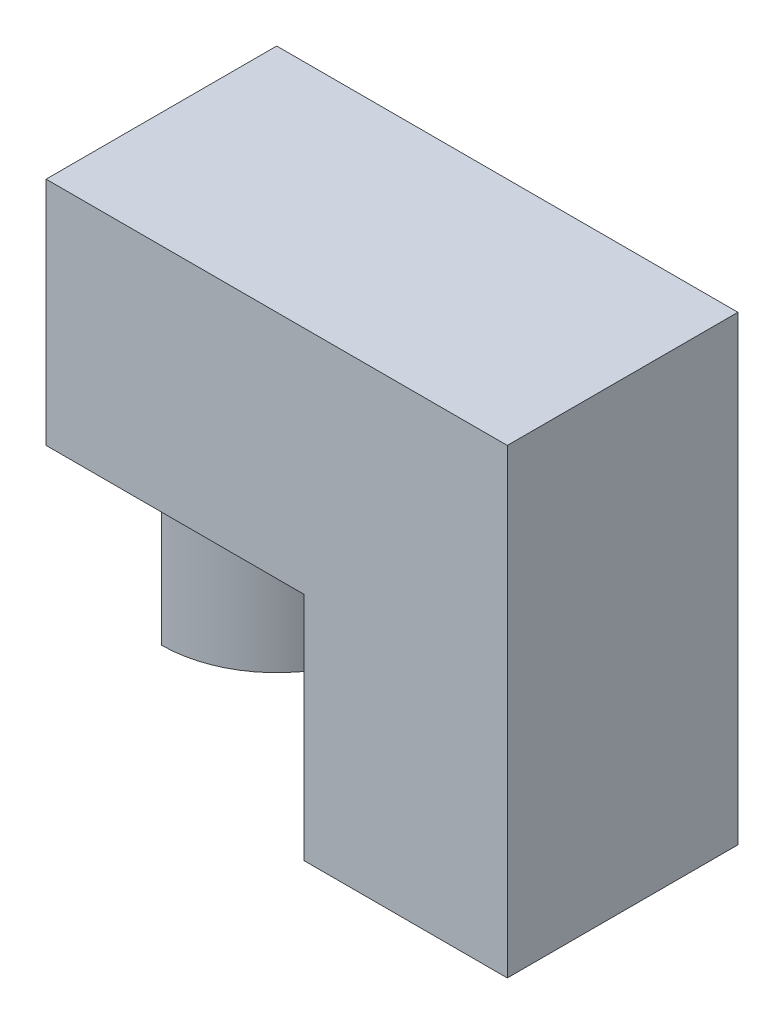
ISO-10303-21;
HEADER;
FILE_DESCRIPTION(('STEP AP214'),'2;1');
FILE_NAME('part.step','',(''),(''),'','','');
FILE_SCHEMA(('AUTOMOTIVE_DESIGN { 1 0 10303 214 1 1 1 1 }'));
ENDSEC;
DATA;
#1=APPLICATION_CONTEXT('core data for automotive mechanical design processes');
#2=APPLICATION_PROTOCOL_DEFINITION('international standard','automotive_design',2000,#1);
#3=PRODUCT_CONTEXT('',#1,'mechanical');
#4=PRODUCT('Part','Part','',(#3));
#5=PRODUCT_RELATED_PRODUCT_CATEGORY('part','',(#4));
#6=PRODUCT_DEFINITION_FORMATION('','',#4);
#7=PRODUCT_DEFINITION_CONTEXT('part definition',#1,'design');
#8=PRODUCT_DEFINITION('design','',#6,#7);
#9=PRODUCT_DEFINITION_SHAPE('','',#8);
#10=(LENGTH_UNIT() NAMED_UNIT(*) SI_UNIT(.MILLI.,.METRE.));
#11=(NAMED_UNIT(*) PLANE_ANGLE_UNIT() SI_UNIT($,.RADIAN.));
#12=(NAMED_UNIT(*) SI_UNIT($,.STERADIAN.) SOLID_ANGLE_UNIT());
#13=UNCERTAINTY_MEASURE_WITH_UNIT(LENGTH_MEASURE(1.E-05),#10,'distance_accuracy_value','');
#14=(GEOMETRIC_REPRESENTATION_CONTEXT(3) GLOBAL_UNCERTAINTY_ASSIGNED_CONTEXT((#13)) GLOBAL_UNIT_ASSIGNED_CONTEXT((#10,
#11,#12)) REPRESENTATION_CONTEXT('',''));
#15=CARTESIAN_POINT('',(0.,0.,0.));
#16=DIRECTION('',(0.,0.,1.));
#17=DIRECTION('',(1.,0.,0.));
#18=AXIS2_PLACEMENT_3D('',#15,#16,#17);
#19=CARTESIAN_POINT('',(0.,0.,10.));
#20=DIRECTION('',(0.,1.,0.));
#21=DIRECTION('',(0.,0.,1.));
#22=AXIS2_PLACEMENT_3D('',#19,#20,#21);
#23=PLANE('',#22);
#24=DIRECTION('',(1.,0.,0.));
#25=VECTOR('',#24,1.);
#26=CARTESIAN_POINT('',(0.,0.,0.));
#27=LINE('',#26,#25);
#28=CARTESIAN_POINT('',(0.,0.,0.));
#29=VERTEX_POINT('',#28);
#30=CARTESIAN_POINT('',(5.,0.,0.));
#31=VERTEX_POINT('',#30);
#32=EDGE_CURVE('E132',#29,#31,#27,.T.);
#33=ORIENTED_EDGE('',*,*,#32,.T.);
#34=CARTESIAN_POINT('',(0.,0.,0.));
#35=DIRECTION('',(0.,-1.,0.));
#36=DIRECTION('',(0.,0.,-1.));
#37=AXIS2_PLACEMENT_3D('',#34,#35,#36);
#38=CIRCLE('',#37,5.);
#39=CARTESIAN_POINT('',(0.,0.,5.));
#40=VERTEX_POINT('',#39);
#41=EDGE_CURVE('E130',#31,#40,#38,.T.);
#42=ORIENTED_EDGE('',*,*,#41,.T.);
#43=DIRECTION('',(0.,0.,-1.));
#44=VECTOR('',#43,1.);
#45=CARTESIAN_POINT('',(0.,0.,10.));
#46=LINE('',#45,#44);
#47=EDGE_CURVE('E123',#40,#29,#46,.T.);
#48=ORIENTED_EDGE('',*,*,#47,.T.);
#49=EDGE_LOOP('',(#33,#42,#48));
#50=FACE_BOUND('',#49,.T.);
#51=ADVANCED_FACE('F45',(#50),#23,.F.);
#52=CARTESIAN_POINT('',(0.,0.,10.));
#53=DIRECTION('',(1.,0.,0.));
#54=DIRECTION('',(0.,0.,-1.));
#55=AXIS2_PLACEMENT_3D('',#52,#53,#54);
#56=PLANE('',#55);
#57=ORIENTED_EDGE('',*,*,#47,.F.);
#58=DIRECTION('',(0.,-1.,0.));
#59=VECTOR('',#58,1.);
#60=CARTESIAN_POINT('',(0.,0.,5.));
#61=LINE('',#60,#59);
#62=CARTESIAN_POINT('',(0.,10.,5.));
#63=VERTEX_POINT('',#62);
#64=EDGE_CURVE('E139',#40,#63,#61,.F.);
#65=ORIENTED_EDGE('',*,*,#64,.T.);
#66=DIRECTION('',(0.,0.,1.));
#67=VECTOR('',#66,1.);
#68=CARTESIAN_POINT('',(0.,10.,10.));
#69=LINE('',#68,#67);
#70=CARTESIAN_POINT('',(0.,10.,10.));
#71=VERTEX_POINT('',#70);
#72=EDGE_CURVE('E171',#63,#71,#69,.T.);
#73=ORIENTED_EDGE('',*,*,#72,.T.);
#74=DIRECTION('',(0.,-1.,0.));
#75=VECTOR('',#74,1.);
#76=CARTESIAN_POINT('',(0.,0.,10.));
#77=LINE('',#76,#75);
#78=CARTESIAN_POINT('',(0.,20.,10.));
#79=VERTEX_POINT('',#78);
#80=EDGE_CURVE('E145',#79,#71,#77,.T.);
#81=ORIENTED_EDGE('',*,*,#80,.F.);
#82=DIRECTION('',(0.,0.,-1.));
#83=VECTOR('',#82,1.);
#84=CARTESIAN_POINT('',(0.,20.,10.));
#85=LINE('',#84,#83);
#86=CARTESIAN_POINT('',(0.,20.,0.));
#87=VERTEX_POINT('',#86);
#88=EDGE_CURVE('E144',#79,#87,#85,.T.);
#89=ORIENTED_EDGE('',*,*,#88,.T.);
#90=DIRECTION('',(0.,-1.,0.));
#91=VECTOR('',#90,1.);
#92=CARTESIAN_POINT('',(0.,0.,0.));
#93=LINE('',#92,#91);
#94=EDGE_CURVE('E135',#87,#29,#93,.T.);
#95=ORIENTED_EDGE('',*,*,#94,.T.);
#96=EDGE_LOOP('',(#57,#65,#73,#81,#89,#95));
#97=FACE_BOUND('',#96,.T.);
#98=ADVANCED_FACE('F42',(#97),#56,.F.);
#99=DIRECTION('',(1.,0.,0.));
#100=VECTOR('',#99,1.);
#101=CARTESIAN_POINT('',(0.,0.,10.));
#102=LINE('',#101,#100);
#103=CARTESIAN_POINT('',(11.1803398874989,0.,10.));
#104=VERTEX_POINT('',#103);
#105=CARTESIAN_POINT('',(20.,0.,10.));
#106=VERTEX_POINT('',#105);
#107=EDGE_CURVE('E93',#104,#106,#102,.T.);
#108=ORIENTED_EDGE('',*,*,#107,.F.);
#109=CARTESIAN_POINT('',(0.,0.,0.));
#110=DIRECTION('',(0.,-1.,0.));
#111=DIRECTION('',(0.,0.,-1.));
#112=AXIS2_PLACEMENT_3D('',#109,#110,#111);
#113=CIRCLE('',#112,15.);
#114=CARTESIAN_POINT('',(15.,0.,0.));
#115=VERTEX_POINT('',#114);
#116=EDGE_CURVE('E119',#115,#104,#113,.T.);
#117=ORIENTED_EDGE('',*,*,#116,.F.);
#118=CARTESIAN_POINT('',(20.,0.,0.));
#119=VERTEX_POINT('',#118);
#120=EDGE_CURVE('E122',#115,#119,#27,.T.);
#121=ORIENTED_EDGE('',*,*,#120,.T.);
#122=DIRECTION('',(0.,0.,-1.));
#123=VECTOR('',#122,1.);
#124=CARTESIAN_POINT('',(20.,0.,10.));
#125=LINE('',#124,#123);
#126=EDGE_CURVE('E149',#106,#119,#125,.T.);
#127=ORIENTED_EDGE('',*,*,#126,.F.);
#128=EDGE_LOOP('',(#108,#117,#121,#127));
#129=FACE_BOUND('',#128,.T.);
#130=ADVANCED_FACE('F124',(#129),#23,.F.);
#131=CARTESIAN_POINT('',(20.,0.,10.));
#132=DIRECTION('',(-1.,0.,0.));
#133=DIRECTION('',(0.,0.,1.));
#134=AXIS2_PLACEMENT_3D('',#131,#132,#133);
#135=PLANE('',#134);
#136=DIRECTION('',(0.,1.,0.));
#137=VECTOR('',#136,1.);
#138=CARTESIAN_POINT('',(20.,0.,0.));
#139=LINE('',#138,#137);
#140=CARTESIAN_POINT('',(20.,20.,0.));
#141=VERTEX_POINT('',#140);
#142=EDGE_CURVE('E134',#119,#141,#139,.T.);
#143=ORIENTED_EDGE('',*,*,#142,.T.);
#144=DIRECTION('',(0.,0.,-1.));
#145=VECTOR('',#144,1.);
#146=CARTESIAN_POINT('',(20.,20.,10.));
#147=LINE('',#146,#145);
#148=CARTESIAN_POINT('',(20.,20.,10.));
#149=VERTEX_POINT('',#148);
#150=EDGE_CURVE('E150',#149,#141,#147,.T.);
#151=ORIENTED_EDGE('',*,*,#150,.F.);
#152=DIRECTION('',(0.,1.,0.));
#153=VECTOR('',#152,1.);
#154=CARTESIAN_POINT('',(20.,0.,10.));
#155=LINE('',#154,#153);
#156=EDGE_CURVE('E166',#106,#149,#155,.T.);
#157=ORIENTED_EDGE('',*,*,#156,.F.);
#158=ORIENTED_EDGE('',*,*,#126,.T.);
#159=EDGE_LOOP('',(#143,#151,#157,#158));
#160=FACE_BOUND('',#159,.T.);
#161=ADVANCED_FACE('F203',(#160),#135,.F.);
#162=CARTESIAN_POINT('',(0.,20.,10.));
#163=DIRECTION('',(0.,-1.,0.));
#164=DIRECTION('',(0.,0.,-1.));
#165=AXIS2_PLACEMENT_3D('',#162,#163,#164);
#166=PLANE('',#165);
#167=DIRECTION('',(-1.,0.,0.));
#168=VECTOR('',#167,1.);
#169=CARTESIAN_POINT('',(0.,20.,0.));
#170=LINE('',#169,#168);
#171=EDGE_CURVE('E88',#141,#87,#170,.T.);
#172=ORIENTED_EDGE('',*,*,#171,.T.);
#173=ORIENTED_EDGE('',*,*,#88,.F.);
#174=DIRECTION('',(-1.,0.,0.));
#175=VECTOR('',#174,1.);
#176=CARTESIAN_POINT('',(0.,20.,10.));
#177=LINE('',#176,#175);
#178=EDGE_CURVE('E68',#149,#79,#177,.T.);
#179=ORIENTED_EDGE('',*,*,#178,.F.);
#180=ORIENTED_EDGE('',*,*,#150,.T.);
#181=EDGE_LOOP('',(#172,#173,#179,#180));
#182=FACE_BOUND('',#181,.T.);
#183=ADVANCED_FACE('F170',(#182),#166,.F.);
#184=CARTESIAN_POINT('',(0.,0.,10.));
#185=DIRECTION('',(0.,0.,-1.));
#186=DIRECTION('',(-1.,0.,0.));
#187=AXIS2_PLACEMENT_3D('',#184,#185,#186);
#188=PLANE('',#187);
#189=ORIENTED_EDGE('',*,*,#80,.T.);
#190=DIRECTION('',(1.,0.,0.));
#191=VECTOR('',#190,1.);
#192=CARTESIAN_POINT('',(0.,10.,10.));
#193=LINE('',#192,#191);
#194=CARTESIAN_POINT('',(11.1803398874989,10.,10.));
#195=VERTEX_POINT('',#194);
#196=EDGE_CURVE('E180',#71,#195,#193,.T.);
#197=ORIENTED_EDGE('',*,*,#196,.T.);
#198=DIRECTION('',(0.,-1.,0.));
#199=VECTOR('',#198,1.);
#200=CARTESIAN_POINT('',(11.1803398874989,0.,10.));
#201=LINE('',#200,#199);
#202=EDGE_CURVE('E179',#195,#104,#201,.T.);
#203=ORIENTED_EDGE('',*,*,#202,.T.);
#204=ORIENTED_EDGE('',*,*,#107,.T.);
#205=ORIENTED_EDGE('',*,*,#156,.T.);
#206=ORIENTED_EDGE('',*,*,#178,.T.);
#207=EDGE_LOOP('',(#189,#197,#203,#204,#205,#206));
#208=FACE_BOUND('',#207,.T.);
#209=ADVANCED_FACE('F191',(#208),#188,.F.);
#210=CARTESIAN_POINT('',(0.,0.,0.));
#211=DIRECTION('',(0.,0.,-1.));
#212=DIRECTION('',(-1.,0.,0.));
#213=AXIS2_PLACEMENT_3D('',#210,#211,#212);
#214=PLANE('',#213);
#215=DIRECTION('',(0.,-1.,0.));
#216=VECTOR('',#215,1.);
#217=CARTESIAN_POINT('',(5.,0.,0.));
#218=LINE('',#217,#216);
#219=CARTESIAN_POINT('',(5.,10.,0.));
#220=VERTEX_POINT('',#219);
#221=EDGE_CURVE('E11',#31,#220,#218,.F.);
#222=ORIENTED_EDGE('',*,*,#221,.F.);
#223=ORIENTED_EDGE('',*,*,#32,.F.);
#224=ORIENTED_EDGE('',*,*,#94,.F.);
#225=ORIENTED_EDGE('',*,*,#171,.F.);
#226=ORIENTED_EDGE('',*,*,#142,.F.);
#227=ORIENTED_EDGE('',*,*,#120,.F.);
#228=DIRECTION('',(0.,-1.,0.));
#229=VECTOR('',#228,1.);
#230=CARTESIAN_POINT('',(15.,0.,0.));
#231=LINE('',#230,#229);
#232=CARTESIAN_POINT('',(15.,10.,0.));
#233=VERTEX_POINT('',#232);
#234=EDGE_CURVE('E111',#233,#115,#231,.T.);
#235=ORIENTED_EDGE('',*,*,#234,.F.);
#236=DIRECTION('',(1.,0.,0.));
#237=VECTOR('',#236,1.);
#238=CARTESIAN_POINT('',(0.,10.,0.));
#239=LINE('',#238,#237);
#240=EDGE_CURVE('E49',#220,#233,#239,.T.);
#241=ORIENTED_EDGE('',*,*,#240,.F.);
#242=EDGE_LOOP('',(#222,#223,#224,#225,#226,#227,#235,#241));
#243=FACE_BOUND('',#242,.T.);
#244=ADVANCED_FACE('F133',(#243),#214,.T.);
#245=CARTESIAN_POINT('',(0.,0.,0.));
#246=DIRECTION('',(0.,-1.,0.));
#247=DIRECTION('',(0.,0.,-1.));
#248=AXIS2_PLACEMENT_3D('',#245,#246,#247);
#249=CYLINDRICAL_SURFACE('',#248,5.);
#250=ORIENTED_EDGE('',*,*,#41,.F.);
#251=ORIENTED_EDGE('',*,*,#221,.T.);
#252=CARTESIAN_POINT('',(0.,10.,0.));
#253=DIRECTION('',(0.,-1.,0.));
#254=DIRECTION('',(0.,0.,-1.));
#255=AXIS2_PLACEMENT_3D('',#252,#253,#254);
#256=CIRCLE('',#255,5.);
#257=EDGE_CURVE('E156',#220,#63,#256,.T.);
#258=ORIENTED_EDGE('',*,*,#257,.T.);
#259=ORIENTED_EDGE('',*,*,#64,.F.);
#260=EDGE_LOOP('',(#250,#251,#258,#259));
#261=FACE_BOUND('',#260,.T.);
#262=ADVANCED_FACE('F181',(#261),#249,.T.);
#263=CARTESIAN_POINT('',(5.,10.,0.));
#264=DIRECTION('',(0.,1.,0.));
#265=DIRECTION('',(0.,0.,1.));
#266=AXIS2_PLACEMENT_3D('',#263,#264,#265);
#267=PLANE('',#266);
#268=ORIENTED_EDGE('',*,*,#257,.F.);
#269=ORIENTED_EDGE('',*,*,#240,.T.);
#270=CARTESIAN_POINT('',(0.,10.,0.));
#271=DIRECTION('',(0.,-1.,0.));
#272=DIRECTION('',(0.,0.,-1.));
#273=AXIS2_PLACEMENT_3D('',#270,#271,#272);
#274=CIRCLE('',#273,15.);
#275=EDGE_CURVE('E60',#233,#195,#274,.T.);
#276=ORIENTED_EDGE('',*,*,#275,.T.);
#277=ORIENTED_EDGE('',*,*,#196,.F.);
#278=ORIENTED_EDGE('',*,*,#72,.F.);
#279=EDGE_LOOP('',(#268,#269,#276,#277,#278));
#280=FACE_BOUND('',#279,.T.);
#281=ADVANCED_FACE('F153',(#280),#267,.F.);
#282=CARTESIAN_POINT('',(0.,0.,0.));
#283=DIRECTION('',(0.,-1.,0.));
#284=DIRECTION('',(0.,0.,-1.));
#285=AXIS2_PLACEMENT_3D('',#282,#283,#284);
#286=CYLINDRICAL_SURFACE('',#285,15.);
#287=ORIENTED_EDGE('',*,*,#275,.F.);
#288=ORIENTED_EDGE('',*,*,#234,.T.);
#289=ORIENTED_EDGE('',*,*,#116,.T.);
#290=ORIENTED_EDGE('',*,*,#202,.F.);
#291=EDGE_LOOP('',(#287,#288,#289,#290));
#292=FACE_BOUND('',#291,.T.);
#293=ADVANCED_FACE('F118',(#292),#286,.F.);
#294=CLOSED_SHELL('',(#51,#98,#130,#161,#183,#209,#244,#262,#281,#293));
#295=MANIFOLD_SOLID_BREP('B2',#294);
#296=ADVANCED_BREP_SHAPE_REPRESENTATION('',(#18,#295),#14);
#297=SHAPE_DEFINITION_REPRESENTATION(#9,#296);
ENDSEC;
END-ISO-10303-21;
